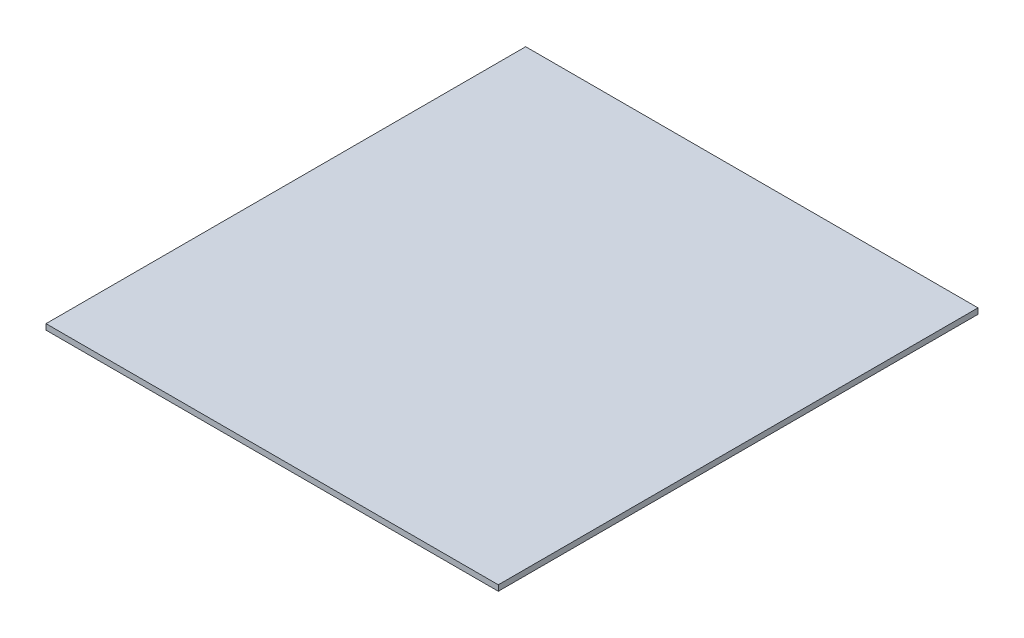
ISO-10303-21;
HEADER;
FILE_DESCRIPTION(('STEP AP214'),'2;1');
FILE_NAME('part.step','',(''),(''),'','','');
FILE_SCHEMA(('AUTOMOTIVE_DESIGN { 1 0 10303 214 1 1 1 1 }'));
ENDSEC;
DATA;
#1=APPLICATION_CONTEXT('core data for automotive mechanical design processes');
#2=APPLICATION_PROTOCOL_DEFINITION('international standard','automotive_design',2000,#1);
#3=PRODUCT_CONTEXT('',#1,'mechanical');
#4=PRODUCT('Part','Part','',(#3));
#5=PRODUCT_RELATED_PRODUCT_CATEGORY('part','',(#4));
#6=PRODUCT_DEFINITION_FORMATION('','',#4);
#7=PRODUCT_DEFINITION_CONTEXT('part definition',#1,'design');
#8=PRODUCT_DEFINITION('design','',#6,#7);
#9=PRODUCT_DEFINITION_SHAPE('','',#8);
#10=(LENGTH_UNIT() NAMED_UNIT(*) SI_UNIT(.MILLI.,.METRE.));
#11=(NAMED_UNIT(*) PLANE_ANGLE_UNIT() SI_UNIT($,.RADIAN.));
#12=(NAMED_UNIT(*) SI_UNIT($,.STERADIAN.) SOLID_ANGLE_UNIT());
#13=UNCERTAINTY_MEASURE_WITH_UNIT(LENGTH_MEASURE(1.E-05),#10,'distance_accuracy_value','');
#14=(GEOMETRIC_REPRESENTATION_CONTEXT(3) GLOBAL_UNCERTAINTY_ASSIGNED_CONTEXT((#13)) GLOBAL_UNIT_ASSIGNED_CONTEXT((#10,
#11,#12)) REPRESENTATION_CONTEXT('',''));
#15=CARTESIAN_POINT('',(0.,0.,0.));
#16=DIRECTION('',(0.,0.,1.));
#17=DIRECTION('',(1.,0.,0.));
#18=AXIS2_PLACEMENT_3D('',#15,#16,#17);
#19=CARTESIAN_POINT('',(78.5,1.96,83.25));
#20=DIRECTION('',(-1.,0.,0.));
#21=DIRECTION('',(0.,0.,1.));
#22=AXIS2_PLACEMENT_3D('',#19,#20,#21);
#23=PLANE('',#22);
#24=DIRECTION('',(0.,0.,-1.));
#25=VECTOR('',#24,1.);
#26=CARTESIAN_POINT('',(78.5,0.,83.25));
#27=LINE('',#26,#25);
#28=CARTESIAN_POINT('',(78.5,0.,83.25));
#29=VERTEX_POINT('',#28);
#30=CARTESIAN_POINT('',(78.5,0.,-83.25));
#31=VERTEX_POINT('',#30);
#32=EDGE_CURVE('E99',#29,#31,#27,.T.);
#33=ORIENTED_EDGE('',*,*,#32,.T.);
#34=DIRECTION('',(0.,-1.,0.));
#35=VECTOR('',#34,1.);
#36=CARTESIAN_POINT('',(78.5,1.96,-83.25));
#37=LINE('',#36,#35);
#38=CARTESIAN_POINT('',(78.5,1.96,-83.25));
#39=VERTEX_POINT('',#38);
#40=EDGE_CURVE('E11',#39,#31,#37,.T.);
#41=ORIENTED_EDGE('',*,*,#40,.F.);
#42=DIRECTION('',(0.,0.,-1.));
#43=VECTOR('',#42,1.);
#44=CARTESIAN_POINT('',(78.5,1.96,83.25));
#45=LINE('',#44,#43);
#46=CARTESIAN_POINT('',(78.5,1.96,83.25));
#47=VERTEX_POINT('',#46);
#48=EDGE_CURVE('E87',#47,#39,#45,.T.);
#49=ORIENTED_EDGE('',*,*,#48,.F.);
#50=DIRECTION('',(0.,-1.,0.));
#51=VECTOR('',#50,1.);
#52=CARTESIAN_POINT('',(78.5,1.96,83.25));
#53=LINE('',#52,#51);
#54=EDGE_CURVE('E95',#47,#29,#53,.T.);
#55=ORIENTED_EDGE('',*,*,#54,.T.);
#56=EDGE_LOOP('',(#33,#41,#49,#55));
#57=FACE_BOUND('',#56,.T.);
#58=ADVANCED_FACE('F36',(#57),#23,.F.);
#59=CARTESIAN_POINT('',(-78.5,1.96,-83.25));
#60=DIRECTION('',(0.,0.,1.));
#61=DIRECTION('',(1.,0.,0.));
#62=AXIS2_PLACEMENT_3D('',#59,#60,#61);
#63=PLANE('',#62);
#64=DIRECTION('',(-1.,0.,0.));
#65=VECTOR('',#64,1.);
#66=CARTESIAN_POINT('',(-78.5,0.,-83.25));
#67=LINE('',#66,#65);
#68=CARTESIAN_POINT('',(-78.5,0.,-83.25));
#69=VERTEX_POINT('',#68);
#70=EDGE_CURVE('E91',#31,#69,#67,.T.);
#71=ORIENTED_EDGE('',*,*,#70,.T.);
#72=DIRECTION('',(0.,-1.,0.));
#73=VECTOR('',#72,1.);
#74=CARTESIAN_POINT('',(-78.5,1.96,-83.25));
#75=LINE('',#74,#73);
#76=CARTESIAN_POINT('',(-78.5,1.96,-83.25));
#77=VERTEX_POINT('',#76);
#78=EDGE_CURVE('E44',#77,#69,#75,.T.);
#79=ORIENTED_EDGE('',*,*,#78,.F.);
#80=DIRECTION('',(-1.,0.,0.));
#81=VECTOR('',#80,1.);
#82=CARTESIAN_POINT('',(-78.5,1.96,-83.25));
#83=LINE('',#82,#81);
#84=EDGE_CURVE('E82',#39,#77,#83,.T.);
#85=ORIENTED_EDGE('',*,*,#84,.F.);
#86=ORIENTED_EDGE('',*,*,#40,.T.);
#87=EDGE_LOOP('',(#71,#79,#85,#86));
#88=FACE_BOUND('',#87,.T.);
#89=ADVANCED_FACE('F90',(#88),#63,.F.);
#90=CARTESIAN_POINT('',(-78.5,1.96,83.25));
#91=DIRECTION('',(1.,0.,0.));
#92=DIRECTION('',(0.,0.,-1.));
#93=AXIS2_PLACEMENT_3D('',#90,#91,#92);
#94=PLANE('',#93);
#95=DIRECTION('',(0.,0.,1.));
#96=VECTOR('',#95,1.);
#97=CARTESIAN_POINT('',(-78.5,0.,83.25));
#98=LINE('',#97,#96);
#99=CARTESIAN_POINT('',(-78.5,0.,83.25));
#100=VERTEX_POINT('',#99);
#101=EDGE_CURVE('E69',#69,#100,#98,.T.);
#102=ORIENTED_EDGE('',*,*,#101,.T.);
#103=DIRECTION('',(0.,-1.,0.));
#104=VECTOR('',#103,1.);
#105=CARTESIAN_POINT('',(-78.5,1.96,83.25));
#106=LINE('',#105,#104);
#107=CARTESIAN_POINT('',(-78.5,1.96,83.25));
#108=VERTEX_POINT('',#107);
#109=EDGE_CURVE('E92',#108,#100,#106,.T.);
#110=ORIENTED_EDGE('',*,*,#109,.F.);
#111=DIRECTION('',(0.,0.,1.));
#112=VECTOR('',#111,1.);
#113=CARTESIAN_POINT('',(-78.5,1.96,83.25));
#114=LINE('',#113,#112);
#115=EDGE_CURVE('E85',#77,#108,#114,.T.);
#116=ORIENTED_EDGE('',*,*,#115,.F.);
#117=ORIENTED_EDGE('',*,*,#78,.T.);
#118=EDGE_LOOP('',(#102,#110,#116,#117));
#119=FACE_BOUND('',#118,.T.);
#120=ADVANCED_FACE('F93',(#119),#94,.F.);
#121=CARTESIAN_POINT('',(-78.5,1.96,83.25));
#122=DIRECTION('',(0.,0.,-1.));
#123=DIRECTION('',(-1.,0.,0.));
#124=AXIS2_PLACEMENT_3D('',#121,#122,#123);
#125=PLANE('',#124);
#126=DIRECTION('',(1.,0.,0.));
#127=VECTOR('',#126,1.);
#128=CARTESIAN_POINT('',(-78.5,0.,83.25));
#129=LINE('',#128,#127);
#130=EDGE_CURVE('E75',#100,#29,#129,.T.);
#131=ORIENTED_EDGE('',*,*,#130,.T.);
#132=ORIENTED_EDGE('',*,*,#54,.F.);
#133=DIRECTION('',(1.,0.,0.));
#134=VECTOR('',#133,1.);
#135=CARTESIAN_POINT('',(-78.5,1.96,83.25));
#136=LINE('',#135,#134);
#137=EDGE_CURVE('E52',#108,#47,#136,.T.);
#138=ORIENTED_EDGE('',*,*,#137,.F.);
#139=ORIENTED_EDGE('',*,*,#109,.T.);
#140=EDGE_LOOP('',(#131,#132,#138,#139));
#141=FACE_BOUND('',#140,.T.);
#142=ADVANCED_FACE('F106',(#141),#125,.F.);
#143=CARTESIAN_POINT('',(0.,1.96,0.));
#144=DIRECTION('',(0.,-1.,0.));
#145=DIRECTION('',(0.,0.,-1.));
#146=AXIS2_PLACEMENT_3D('',#143,#144,#145);
#147=PLANE('',#146);
#148=ORIENTED_EDGE('',*,*,#48,.T.);
#149=ORIENTED_EDGE('',*,*,#84,.T.);
#150=ORIENTED_EDGE('',*,*,#115,.T.);
#151=ORIENTED_EDGE('',*,*,#137,.T.);
#152=EDGE_LOOP('',(#148,#149,#150,#151));
#153=FACE_BOUND('',#152,.T.);
#154=ADVANCED_FACE('F83',(#153),#147,.F.);
#155=CARTESIAN_POINT('',(0.,0.,0.));
#156=DIRECTION('',(0.,-1.,0.));
#157=DIRECTION('',(0.,0.,-1.));
#158=AXIS2_PLACEMENT_3D('',#155,#156,#157);
#159=PLANE('',#158);
#160=ORIENTED_EDGE('',*,*,#32,.F.);
#161=ORIENTED_EDGE('',*,*,#130,.F.);
#162=ORIENTED_EDGE('',*,*,#101,.F.);
#163=ORIENTED_EDGE('',*,*,#70,.F.);
#164=EDGE_LOOP('',(#160,#161,#162,#163));
#165=FACE_BOUND('',#164,.T.);
#166=ADVANCED_FACE('F109',(#165),#159,.T.);
#167=CLOSED_SHELL('',(#58,#89,#120,#142,#154,#166));
#168=MANIFOLD_SOLID_BREP('B2',#167);
#169=ADVANCED_BREP_SHAPE_REPRESENTATION('',(#18,#168),#14);
#170=SHAPE_DEFINITION_REPRESENTATION(#9,#169);
ENDSEC;
END-ISO-10303-21;
